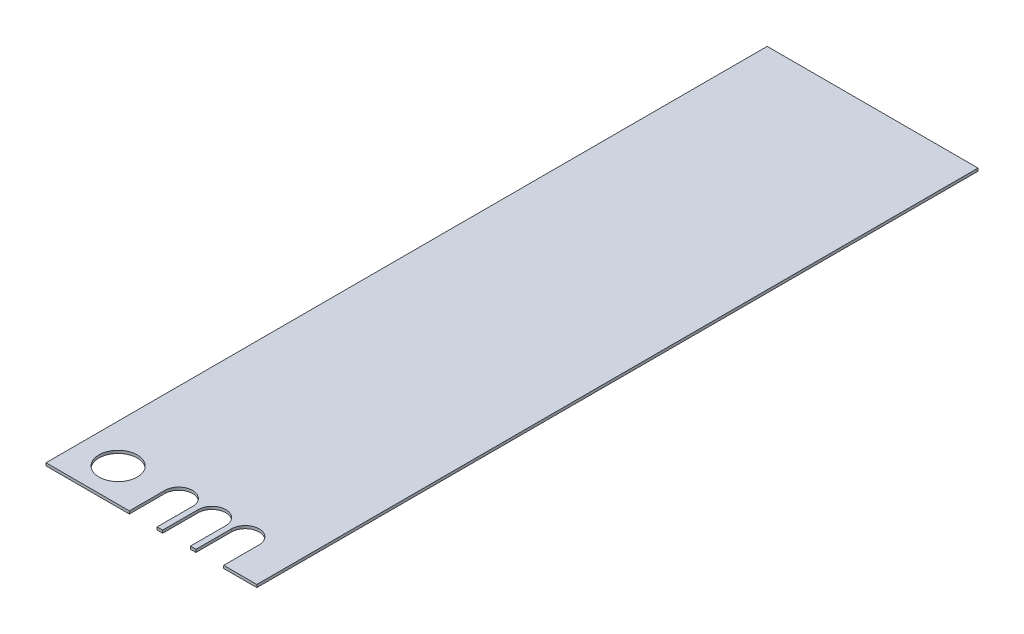
ISO-10303-21;
HEADER;
FILE_DESCRIPTION(('STEP AP214'),'2;1');
FILE_NAME('part.step','',(''),(''),'','','');
FILE_SCHEMA(('AUTOMOTIVE_DESIGN { 1 0 10303 214 1 1 1 1 }'));
ENDSEC;
DATA;
#1=APPLICATION_CONTEXT('core data for automotive mechanical design processes');
#2=APPLICATION_PROTOCOL_DEFINITION('international standard','automotive_design',2000,#1);
#3=PRODUCT_CONTEXT('',#1,'mechanical');
#4=PRODUCT('Part','Part','',(#3));
#5=PRODUCT_RELATED_PRODUCT_CATEGORY('part','',(#4));
#6=PRODUCT_DEFINITION_FORMATION('','',#4);
#7=PRODUCT_DEFINITION_CONTEXT('part definition',#1,'design');
#8=PRODUCT_DEFINITION('design','',#6,#7);
#9=PRODUCT_DEFINITION_SHAPE('','',#8);
#10=(LENGTH_UNIT() NAMED_UNIT(*) SI_UNIT(.MILLI.,.METRE.));
#11=(NAMED_UNIT(*) PLANE_ANGLE_UNIT() SI_UNIT($,.RADIAN.));
#12=(NAMED_UNIT(*) SI_UNIT($,.STERADIAN.) SOLID_ANGLE_UNIT());
#13=UNCERTAINTY_MEASURE_WITH_UNIT(LENGTH_MEASURE(1.E-05),#10,'distance_accuracy_value','');
#14=(GEOMETRIC_REPRESENTATION_CONTEXT(3) GLOBAL_UNCERTAINTY_ASSIGNED_CONTEXT((#13)) GLOBAL_UNIT_ASSIGNED_CONTEXT((#10,
#11,#12)) REPRESENTATION_CONTEXT('',''));
#15=CARTESIAN_POINT('',(0.,0.,0.));
#16=DIRECTION('',(0.,0.,1.));
#17=DIRECTION('',(1.,0.,0.));
#18=AXIS2_PLACEMENT_3D('',#15,#16,#17);
#19=CARTESIAN_POINT('',(-241.3,6.34999999999999,825.5));
#20=DIRECTION('',(0.,0.,-1.));
#21=DIRECTION('',(-1.,0.,0.));
#22=AXIS2_PLACEMENT_3D('',#19,#20,#21);
#23=PLANE('',#22);
#24=DIRECTION('',(1.,0.,0.));
#25=VECTOR('',#24,1.);
#26=CARTESIAN_POINT('',(-241.3,0.,825.5));
#27=LINE('',#26,#25);
#28=CARTESIAN_POINT('',(89.2554804423506,0.,825.5));
#29=VERTEX_POINT('',#28);
#30=CARTESIAN_POINT('',(101.955480442351,0.,825.5));
#31=VERTEX_POINT('',#30);
#32=EDGE_CURVE('E290',#29,#31,#27,.T.);
#33=ORIENTED_EDGE('',*,*,#32,.T.);
#34=DIRECTION('',(0.,-1.,0.));
#35=VECTOR('',#34,1.);
#36=CARTESIAN_POINT('',(101.955480442351,6.34999999999999,825.5));
#37=LINE('',#36,#35);
#38=CARTESIAN_POINT('',(101.955480442351,6.34999999999999,825.5));
#39=VERTEX_POINT('',#38);
#40=EDGE_CURVE('E198',#39,#31,#37,.T.);
#41=ORIENTED_EDGE('',*,*,#40,.F.);
#42=DIRECTION('',(1.,0.,0.));
#43=VECTOR('',#42,1.);
#44=CARTESIAN_POINT('',(-241.3,6.34999999999999,825.5));
#45=LINE('',#44,#43);
#46=CARTESIAN_POINT('',(89.2554804423506,6.34999999999999,825.5));
#47=VERTEX_POINT('',#46);
#48=EDGE_CURVE('E306',#47,#39,#45,.T.);
#49=ORIENTED_EDGE('',*,*,#48,.F.);
#50=DIRECTION('',(0.,-1.,0.));
#51=VECTOR('',#50,1.);
#52=CARTESIAN_POINT('',(89.2554804423506,6.34999999999999,825.5));
#53=LINE('',#52,#51);
#54=EDGE_CURVE('E225',#47,#29,#53,.T.);
#55=ORIENTED_EDGE('',*,*,#54,.T.);
#56=EDGE_LOOP('',(#33,#41,#49,#55));
#57=FACE_BOUND('',#56,.T.);
#58=ADVANCED_FACE('F32',(#57),#23,.F.);
#59=CARTESIAN_POINT('',(-241.3,0.,825.5));
#60=VERTEX_POINT('',#59);
#61=CARTESIAN_POINT('',(-50.4445195576494,0.,825.5));
#62=VERTEX_POINT('',#61);
#63=EDGE_CURVE('E240',#60,#62,#27,.T.);
#64=ORIENTED_EDGE('',*,*,#63,.T.);
#65=DIRECTION('',(0.,-1.,0.));
#66=VECTOR('',#65,1.);
#67=CARTESIAN_POINT('',(-50.4445195576494,6.34999999999999,825.5));
#68=LINE('',#67,#66);
#69=CARTESIAN_POINT('',(-50.4445195576494,6.34999999999999,825.5));
#70=VERTEX_POINT('',#69);
#71=EDGE_CURVE('E178',#70,#62,#68,.T.);
#72=ORIENTED_EDGE('',*,*,#71,.F.);
#73=CARTESIAN_POINT('',(-241.3,6.34999999999999,825.5));
#74=VERTEX_POINT('',#73);
#75=EDGE_CURVE('E245',#74,#70,#45,.T.);
#76=ORIENTED_EDGE('',*,*,#75,.F.);
#77=DIRECTION('',(0.,-1.,0.));
#78=VECTOR('',#77,1.);
#79=CARTESIAN_POINT('',(-241.3,6.34999999999999,825.5));
#80=LINE('',#79,#78);
#81=EDGE_CURVE('E261',#74,#60,#80,.T.);
#82=ORIENTED_EDGE('',*,*,#81,.T.);
#83=EDGE_LOOP('',(#64,#72,#76,#82));
#84=FACE_BOUND('',#83,.T.);
#85=ADVANCED_FACE('F280',(#84),#23,.F.);
#86=CARTESIAN_POINT('',(13.0554804423505,6.34999999999999,825.5));
#87=VERTEX_POINT('',#86);
#88=CARTESIAN_POINT('',(25.7554804423506,6.34999999999999,825.5));
#89=VERTEX_POINT('',#88);
#90=EDGE_CURVE('E248',#87,#89,#45,.T.);
#91=ORIENTED_EDGE('',*,*,#90,.F.);
#92=DIRECTION('',(0.,-1.,0.));
#93=VECTOR('',#92,1.);
#94=CARTESIAN_POINT('',(13.0554804423505,6.34999999999999,825.5));
#95=LINE('',#94,#93);
#96=CARTESIAN_POINT('',(13.0554804423505,0.,825.5));
#97=VERTEX_POINT('',#96);
#98=EDGE_CURVE('E151',#87,#97,#95,.T.);
#99=ORIENTED_EDGE('',*,*,#98,.T.);
#100=CARTESIAN_POINT('',(25.7554804423506,0.,825.5));
#101=VERTEX_POINT('',#100);
#102=EDGE_CURVE('E258',#97,#101,#27,.T.);
#103=ORIENTED_EDGE('',*,*,#102,.T.);
#104=DIRECTION('',(0.,-1.,0.));
#105=VECTOR('',#104,1.);
#106=CARTESIAN_POINT('',(25.7554804423506,6.34999999999999,825.5));
#107=LINE('',#106,#105);
#108=EDGE_CURVE('E223',#89,#101,#107,.T.);
#109=ORIENTED_EDGE('',*,*,#108,.F.);
#110=EDGE_LOOP('',(#91,#99,#103,#109));
#111=FACE_BOUND('',#110,.T.);
#112=ADVANCED_FACE('F299',(#111),#23,.F.);
#113=CARTESIAN_POINT('',(241.3,6.34999999999999,825.5));
#114=DIRECTION('',(-1.,0.,0.));
#115=DIRECTION('',(0.,0.,1.));
#116=AXIS2_PLACEMENT_3D('',#113,#114,#115);
#117=PLANE('',#116);
#118=DIRECTION('',(0.,0.,-1.));
#119=VECTOR('',#118,1.);
#120=CARTESIAN_POINT('',(241.3,0.,825.5));
#121=LINE('',#120,#119);
#122=CARTESIAN_POINT('',(241.3,0.,825.5));
#123=VERTEX_POINT('',#122);
#124=CARTESIAN_POINT('',(241.3,0.,-825.5));
#125=VERTEX_POINT('',#124);
#126=EDGE_CURVE('E233',#123,#125,#121,.T.);
#127=ORIENTED_EDGE('',*,*,#126,.T.);
#128=DIRECTION('',(0.,-1.,0.));
#129=VECTOR('',#128,1.);
#130=CARTESIAN_POINT('',(241.3,6.34999999999999,-825.5));
#131=LINE('',#130,#129);
#132=CARTESIAN_POINT('',(241.3,6.34999999999999,-825.5));
#133=VERTEX_POINT('',#132);
#134=EDGE_CURVE('E11',#133,#125,#131,.T.);
#135=ORIENTED_EDGE('',*,*,#134,.F.);
#136=DIRECTION('',(0.,0.,-1.));
#137=VECTOR('',#136,1.);
#138=CARTESIAN_POINT('',(241.3,6.34999999999999,825.5));
#139=LINE('',#138,#137);
#140=CARTESIAN_POINT('',(241.3,6.34999999999999,825.5));
#141=VERTEX_POINT('',#140);
#142=EDGE_CURVE('E236',#141,#133,#139,.T.);
#143=ORIENTED_EDGE('',*,*,#142,.F.);
#144=DIRECTION('',(0.,-1.,0.));
#145=VECTOR('',#144,1.);
#146=CARTESIAN_POINT('',(241.3,6.34999999999999,825.5));
#147=LINE('',#146,#145);
#148=EDGE_CURVE('E247',#141,#123,#147,.T.);
#149=ORIENTED_EDGE('',*,*,#148,.T.);
#150=EDGE_LOOP('',(#127,#135,#143,#149));
#151=FACE_BOUND('',#150,.T.);
#152=ADVANCED_FACE('F34',(#151),#117,.F.);
#153=CARTESIAN_POINT('',(-241.3,6.34999999999999,-825.5));
#154=DIRECTION('',(0.,0.,1.));
#155=DIRECTION('',(1.,0.,0.));
#156=AXIS2_PLACEMENT_3D('',#153,#154,#155);
#157=PLANE('',#156);
#158=DIRECTION('',(-1.,0.,0.));
#159=VECTOR('',#158,1.);
#160=CARTESIAN_POINT('',(-241.3,0.,-825.5));
#161=LINE('',#160,#159);
#162=CARTESIAN_POINT('',(-241.3,0.,-825.5));
#163=VERTEX_POINT('',#162);
#164=EDGE_CURVE('E251',#125,#163,#161,.T.);
#165=ORIENTED_EDGE('',*,*,#164,.T.);
#166=DIRECTION('',(0.,-1.,0.));
#167=VECTOR('',#166,1.);
#168=CARTESIAN_POINT('',(-241.3,6.34999999999999,-825.5));
#169=LINE('',#168,#167);
#170=CARTESIAN_POINT('',(-241.3,6.34999999999999,-825.5));
#171=VERTEX_POINT('',#170);
#172=EDGE_CURVE('E40',#171,#163,#169,.T.);
#173=ORIENTED_EDGE('',*,*,#172,.F.);
#174=DIRECTION('',(-1.,0.,0.));
#175=VECTOR('',#174,1.);
#176=CARTESIAN_POINT('',(-241.3,6.34999999999999,-825.5));
#177=LINE('',#176,#175);
#178=EDGE_CURVE('E239',#133,#171,#177,.T.);
#179=ORIENTED_EDGE('',*,*,#178,.F.);
#180=ORIENTED_EDGE('',*,*,#134,.T.);
#181=EDGE_LOOP('',(#165,#173,#179,#180));
#182=FACE_BOUND('',#181,.T.);
#183=ADVANCED_FACE('F284',(#182),#157,.F.);
#184=CARTESIAN_POINT('',(-241.3,6.34999999999999,825.5));
#185=DIRECTION('',(1.,0.,0.));
#186=DIRECTION('',(0.,0.,-1.));
#187=AXIS2_PLACEMENT_3D('',#184,#185,#186);
#188=PLANE('',#187);
#189=DIRECTION('',(0.,0.,1.));
#190=VECTOR('',#189,1.);
#191=CARTESIAN_POINT('',(-241.3,0.,825.5));
#192=LINE('',#191,#190);
#193=EDGE_CURVE('E253',#163,#60,#192,.T.);
#194=ORIENTED_EDGE('',*,*,#193,.T.);
#195=ORIENTED_EDGE('',*,*,#81,.F.);
#196=DIRECTION('',(0.,0.,1.));
#197=VECTOR('',#196,1.);
#198=CARTESIAN_POINT('',(-241.3,6.34999999999999,825.5));
#199=LINE('',#198,#197);
#200=EDGE_CURVE('E242',#171,#74,#199,.T.);
#201=ORIENTED_EDGE('',*,*,#200,.F.);
#202=ORIENTED_EDGE('',*,*,#172,.T.);
#203=EDGE_LOOP('',(#194,#195,#201,#202));
#204=FACE_BOUND('',#203,.T.);
#205=ADVANCED_FACE('F268',(#204),#188,.F.);
#206=CARTESIAN_POINT('',(165.455480442351,6.34999999999999,825.5));
#207=VERTEX_POINT('',#206);
#208=EDGE_CURVE('E244',#207,#141,#45,.T.);
#209=ORIENTED_EDGE('',*,*,#208,.F.);
#210=DIRECTION('',(0.,-1.,0.));
#211=VECTOR('',#210,1.);
#212=CARTESIAN_POINT('',(165.455480442351,6.34999999999999,825.5));
#213=LINE('',#212,#211);
#214=CARTESIAN_POINT('',(165.455480442351,0.,825.5));
#215=VERTEX_POINT('',#214);
#216=EDGE_CURVE('E200',#207,#215,#213,.T.);
#217=ORIENTED_EDGE('',*,*,#216,.T.);
#218=EDGE_CURVE('E255',#215,#123,#27,.T.);
#219=ORIENTED_EDGE('',*,*,#218,.T.);
#220=ORIENTED_EDGE('',*,*,#148,.F.);
#221=EDGE_LOOP('',(#209,#217,#219,#220));
#222=FACE_BOUND('',#221,.T.);
#223=ADVANCED_FACE('F310',(#222),#23,.F.);
#224=CARTESIAN_POINT('',(0.,6.34999999999999,0.));
#225=DIRECTION('',(0.,-1.,0.));
#226=DIRECTION('',(0.,0.,-1.));
#227=AXIS2_PLACEMENT_3D('',#224,#225,#226);
#228=PLANE('',#227);
#229=CARTESIAN_POINT('',(-152.4,6.34999999999999,749.3));
#230=DIRECTION('',(0.,1.,0.));
#231=DIRECTION('',(0.,0.,1.));
#232=AXIS2_PLACEMENT_3D('',#229,#230,#231);
#233=CIRCLE('',#232,43.9236493635122);
#234=CARTESIAN_POINT('',(-152.4,6.34999999999999,793.223649363512));
#235=VERTEX_POINT('',#234);
#236=EDGE_CURVE('E222',#235,#235,#233,.T.);
#237=ORIENTED_EDGE('',*,*,#236,.F.);
#238=EDGE_LOOP('',(#237));
#239=FACE_BOUND('',#238,.T.);
#240=ORIENTED_EDGE('',*,*,#48,.T.);
#241=DIRECTION('',(0.,0.,-1.));
#242=VECTOR('',#241,1.);
#243=CARTESIAN_POINT('',(101.955480442351,6.34999999999999,744.293611592998));
#244=LINE('',#243,#242);
#245=CARTESIAN_POINT('',(101.955480442351,6.34999999999999,744.293611592998));
#246=VERTEX_POINT('',#245);
#247=EDGE_CURVE('E188',#39,#246,#244,.T.);
#248=ORIENTED_EDGE('',*,*,#247,.T.);
#249=CARTESIAN_POINT('',(133.705480442351,6.34999999999999,744.293611592998));
#250=DIRECTION('',(0.,-1.,0.));
#251=DIRECTION('',(0.,0.,-1.));
#252=AXIS2_PLACEMENT_3D('',#249,#250,#251);
#253=CIRCLE('',#252,31.75);
#254=CARTESIAN_POINT('',(165.455480442351,6.34999999999999,744.293611592998));
#255=VERTEX_POINT('',#254);
#256=EDGE_CURVE('E181',#246,#255,#253,.T.);
#257=ORIENTED_EDGE('',*,*,#256,.T.);
#258=DIRECTION('',(0.,0.,1.));
#259=VECTOR('',#258,1.);
#260=CARTESIAN_POINT('',(165.455480442351,6.34999999999999,825.5));
#261=LINE('',#260,#259);
#262=EDGE_CURVE('E184',#255,#207,#261,.T.);
#263=ORIENTED_EDGE('',*,*,#262,.T.);
#264=ORIENTED_EDGE('',*,*,#208,.T.);
#265=ORIENTED_EDGE('',*,*,#142,.T.);
#266=ORIENTED_EDGE('',*,*,#178,.T.);
#267=ORIENTED_EDGE('',*,*,#200,.T.);
#268=ORIENTED_EDGE('',*,*,#75,.T.);
#269=DIRECTION('',(0.,0.,-1.));
#270=VECTOR('',#269,1.);
#271=CARTESIAN_POINT('',(-50.4445195576494,6.34999999999999,744.293611592998));
#272=LINE('',#271,#270);
#273=CARTESIAN_POINT('',(-50.4445195576494,6.34999999999999,744.293611592998));
#274=VERTEX_POINT('',#273);
#275=EDGE_CURVE('E152',#70,#274,#272,.T.);
#276=ORIENTED_EDGE('',*,*,#275,.T.);
#277=CARTESIAN_POINT('',(-18.6945195576494,6.34999999999999,744.293611592998));
#278=DIRECTION('',(0.,-1.,0.));
#279=DIRECTION('',(0.,0.,-1.));
#280=AXIS2_PLACEMENT_3D('',#277,#278,#279);
#281=CIRCLE('',#280,31.75);
#282=CARTESIAN_POINT('',(13.0554804423505,6.34999999999999,744.293611592998));
#283=VERTEX_POINT('',#282);
#284=EDGE_CURVE('E147',#274,#283,#281,.T.);
#285=ORIENTED_EDGE('',*,*,#284,.T.);
#286=DIRECTION('',(0.,0.,1.));
#287=VECTOR('',#286,1.);
#288=CARTESIAN_POINT('',(13.0554804423505,6.34999999999999,825.5));
#289=LINE('',#288,#287);
#290=EDGE_CURVE('E155',#283,#87,#289,.T.);
#291=ORIENTED_EDGE('',*,*,#290,.T.);
#292=ORIENTED_EDGE('',*,*,#90,.T.);
#293=DIRECTION('',(0.,0.,-1.));
#294=VECTOR('',#293,1.);
#295=CARTESIAN_POINT('',(25.7554804423506,6.34999999999999,744.293611592998));
#296=LINE('',#295,#294);
#297=CARTESIAN_POINT('',(25.7554804423506,6.34999999999999,744.293611592998));
#298=VERTEX_POINT('',#297);
#299=EDGE_CURVE('E211',#89,#298,#296,.T.);
#300=ORIENTED_EDGE('',*,*,#299,.T.);
#301=CARTESIAN_POINT('',(57.5054804423506,6.34999999999999,744.293611592998));
#302=DIRECTION('',(0.,-1.,0.));
#303=DIRECTION('',(0.,0.,-1.));
#304=AXIS2_PLACEMENT_3D('',#301,#302,#303);
#305=CIRCLE('',#304,31.75);
#306=CARTESIAN_POINT('',(89.2554804423506,6.34999999999999,744.293611592998));
#307=VERTEX_POINT('',#306);
#308=EDGE_CURVE('E204',#298,#307,#305,.T.);
#309=ORIENTED_EDGE('',*,*,#308,.T.);
#310=DIRECTION('',(0.,0.,1.));
#311=VECTOR('',#310,1.);
#312=CARTESIAN_POINT('',(89.2554804423506,6.34999999999999,825.5));
#313=LINE('',#312,#311);
#314=EDGE_CURVE('E207',#307,#47,#313,.T.);
#315=ORIENTED_EDGE('',*,*,#314,.T.);
#316=EDGE_LOOP('',(#240,#248,#257,#263,#264,#265,#266,#267,#268,#276,#285,#291,#292,#300,#309,#315));
#317=FACE_BOUND('',#316,.T.);
#318=ADVANCED_FACE('F163',(#239,#317),#228,.F.);
#319=CARTESIAN_POINT('',(0.,0.,0.));
#320=DIRECTION('',(0.,-1.,0.));
#321=DIRECTION('',(0.,0.,-1.));
#322=AXIS2_PLACEMENT_3D('',#319,#320,#321);
#323=PLANE('',#322);
#324=DIRECTION('',(0.,0.,-1.));
#325=VECTOR('',#324,1.);
#326=CARTESIAN_POINT('',(101.955480442351,0.,744.293611592998));
#327=LINE('',#326,#325);
#328=CARTESIAN_POINT('',(101.955480442351,0.,744.293611592998));
#329=VERTEX_POINT('',#328);
#330=EDGE_CURVE('E185',#31,#329,#327,.T.);
#331=ORIENTED_EDGE('',*,*,#330,.F.);
#332=ORIENTED_EDGE('',*,*,#32,.F.);
#333=DIRECTION('',(0.,0.,1.));
#334=VECTOR('',#333,1.);
#335=CARTESIAN_POINT('',(89.2554804423506,0.,825.5));
#336=LINE('',#335,#334);
#337=CARTESIAN_POINT('',(89.2554804423506,0.,744.293611592998));
#338=VERTEX_POINT('',#337);
#339=EDGE_CURVE('E216',#338,#29,#336,.T.);
#340=ORIENTED_EDGE('',*,*,#339,.F.);
#341=CARTESIAN_POINT('',(57.5054804423506,0.,744.293611592998));
#342=DIRECTION('',(0.,-1.,0.));
#343=DIRECTION('',(0.,0.,-1.));
#344=AXIS2_PLACEMENT_3D('',#341,#342,#343);
#345=CIRCLE('',#344,31.75);
#346=CARTESIAN_POINT('',(25.7554804423506,0.,744.293611592998));
#347=VERTEX_POINT('',#346);
#348=EDGE_CURVE('E177',#347,#338,#345,.T.);
#349=ORIENTED_EDGE('',*,*,#348,.F.);
#350=DIRECTION('',(0.,0.,-1.));
#351=VECTOR('',#350,1.);
#352=CARTESIAN_POINT('',(25.7554804423506,0.,744.293611592998));
#353=LINE('',#352,#351);
#354=EDGE_CURVE('E208',#101,#347,#353,.T.);
#355=ORIENTED_EDGE('',*,*,#354,.F.);
#356=ORIENTED_EDGE('',*,*,#102,.F.);
#357=DIRECTION('',(0.,0.,1.));
#358=VECTOR('',#357,1.);
#359=CARTESIAN_POINT('',(13.0554804423505,0.,825.5));
#360=LINE('',#359,#358);
#361=CARTESIAN_POINT('',(13.0554804423505,0.,744.293611592998));
#362=VERTEX_POINT('',#361);
#363=EDGE_CURVE('E168',#362,#97,#360,.T.);
#364=ORIENTED_EDGE('',*,*,#363,.F.);
#365=CARTESIAN_POINT('',(-18.6945195576494,0.,744.293611592998));
#366=DIRECTION('',(0.,-1.,0.));
#367=DIRECTION('',(0.,0.,-1.));
#368=AXIS2_PLACEMENT_3D('',#365,#366,#367);
#369=CIRCLE('',#368,31.75);
#370=CARTESIAN_POINT('',(-50.4445195576494,0.,744.293611592998));
#371=VERTEX_POINT('',#370);
#372=EDGE_CURVE('E55',#371,#362,#369,.T.);
#373=ORIENTED_EDGE('',*,*,#372,.F.);
#374=DIRECTION('',(0.,0.,-1.));
#375=VECTOR('',#374,1.);
#376=CARTESIAN_POINT('',(-50.4445195576494,0.,744.293611592998));
#377=LINE('',#376,#375);
#378=EDGE_CURVE('E165',#62,#371,#377,.T.);
#379=ORIENTED_EDGE('',*,*,#378,.F.);
#380=ORIENTED_EDGE('',*,*,#63,.F.);
#381=ORIENTED_EDGE('',*,*,#193,.F.);
#382=ORIENTED_EDGE('',*,*,#164,.F.);
#383=ORIENTED_EDGE('',*,*,#126,.F.);
#384=ORIENTED_EDGE('',*,*,#218,.F.);
#385=DIRECTION('',(0.,0.,1.));
#386=VECTOR('',#385,1.);
#387=CARTESIAN_POINT('',(165.455480442351,0.,825.5));
#388=LINE('',#387,#386);
#389=CARTESIAN_POINT('',(165.455480442351,0.,744.293611592998));
#390=VERTEX_POINT('',#389);
#391=EDGE_CURVE('E193',#390,#215,#388,.T.);
#392=ORIENTED_EDGE('',*,*,#391,.F.);
#393=CARTESIAN_POINT('',(133.705480442351,0.,744.293611592998));
#394=DIRECTION('',(0.,-1.,0.));
#395=DIRECTION('',(0.,0.,-1.));
#396=AXIS2_PLACEMENT_3D('',#393,#394,#395);
#397=CIRCLE('',#396,31.75);
#398=EDGE_CURVE('E47',#329,#390,#397,.T.);
#399=ORIENTED_EDGE('',*,*,#398,.F.);
#400=EDGE_LOOP('',(#331,#332,#340,#349,#355,#356,#364,#373,#379,#380,#381,#382,#383,#384,#392,#399));
#401=FACE_BOUND('',#400,.T.);
#402=CARTESIAN_POINT('',(-152.4,0.,749.3));
#403=DIRECTION('',(0.,1.,0.));
#404=DIRECTION('',(0.,0.,1.));
#405=AXIS2_PLACEMENT_3D('',#402,#403,#404);
#406=CIRCLE('',#405,43.9236493635122);
#407=CARTESIAN_POINT('',(-152.4,0.,793.223649363512));
#408=VERTEX_POINT('',#407);
#409=EDGE_CURVE('E230',#408,#408,#406,.T.);
#410=ORIENTED_EDGE('',*,*,#409,.T.);
#411=EDGE_LOOP('',(#410));
#412=FACE_BOUND('',#411,.T.);
#413=ADVANCED_FACE('F274',(#401,#412),#323,.T.);
#414=CARTESIAN_POINT('',(-152.4,0.,749.3));
#415=DIRECTION('',(0.,1.,0.));
#416=DIRECTION('',(0.,0.,1.));
#417=AXIS2_PLACEMENT_3D('',#414,#415,#416);
#418=CYLINDRICAL_SURFACE('',#417,43.9236493635122);
#419=ORIENTED_EDGE('',*,*,#409,.F.);
#420=EDGE_LOOP('',(#419));
#421=FACE_BOUND('',#420,.T.);
#422=ORIENTED_EDGE('',*,*,#236,.T.);
#423=EDGE_LOOP('',(#422));
#424=FACE_BOUND('',#423,.T.);
#425=ADVANCED_FACE('F347',(#421,#424),#418,.F.);
#426=CARTESIAN_POINT('',(57.5054804423506,6.34999999999999,744.293611592998));
#427=DIRECTION('',(0.,-1.,0.));
#428=DIRECTION('',(0.,0.,-1.));
#429=AXIS2_PLACEMENT_3D('',#426,#427,#428);
#430=CYLINDRICAL_SURFACE('',#429,31.75);
#431=ORIENTED_EDGE('',*,*,#348,.T.);
#432=DIRECTION('',(0.,-1.,0.));
#433=VECTOR('',#432,1.);
#434=CARTESIAN_POINT('',(89.2554804423506,6.34999999999999,744.293611592998));
#435=LINE('',#434,#433);
#436=EDGE_CURVE('E214',#307,#338,#435,.T.);
#437=ORIENTED_EDGE('',*,*,#436,.F.);
#438=ORIENTED_EDGE('',*,*,#308,.F.);
#439=DIRECTION('',(0.,-1.,0.));
#440=VECTOR('',#439,1.);
#441=CARTESIAN_POINT('',(25.7554804423506,6.34999999999999,744.293611592998));
#442=LINE('',#441,#440);
#443=EDGE_CURVE('E220',#298,#347,#442,.T.);
#444=ORIENTED_EDGE('',*,*,#443,.T.);
#445=EDGE_LOOP('',(#431,#437,#438,#444));
#446=FACE_BOUND('',#445,.T.);
#447=ADVANCED_FACE('F341',(#446),#430,.F.);
#448=CARTESIAN_POINT('',(25.7554804423506,6.34999999999999,744.293611592998));
#449=DIRECTION('',(-1.,0.,0.));
#450=DIRECTION('',(0.,0.,1.));
#451=AXIS2_PLACEMENT_3D('',#448,#449,#450);
#452=PLANE('',#451);
#453=ORIENTED_EDGE('',*,*,#354,.T.);
#454=ORIENTED_EDGE('',*,*,#443,.F.);
#455=ORIENTED_EDGE('',*,*,#299,.F.);
#456=ORIENTED_EDGE('',*,*,#108,.T.);
#457=EDGE_LOOP('',(#453,#454,#455,#456));
#458=FACE_BOUND('',#457,.T.);
#459=ADVANCED_FACE('F304',(#458),#452,.F.);
#460=CARTESIAN_POINT('',(89.2554804423506,6.34999999999999,825.5));
#461=DIRECTION('',(1.,0.,0.));
#462=DIRECTION('',(0.,0.,-1.));
#463=AXIS2_PLACEMENT_3D('',#460,#461,#462);
#464=PLANE('',#463);
#465=ORIENTED_EDGE('',*,*,#339,.T.);
#466=ORIENTED_EDGE('',*,*,#54,.F.);
#467=ORIENTED_EDGE('',*,*,#314,.F.);
#468=ORIENTED_EDGE('',*,*,#436,.T.);
#469=EDGE_LOOP('',(#465,#466,#467,#468));
#470=FACE_BOUND('',#469,.T.);
#471=ADVANCED_FACE('F357',(#470),#464,.F.);
#472=CARTESIAN_POINT('',(-18.6945195576494,6.34999999999999,744.293611592998));
#473=DIRECTION('',(0.,-1.,0.));
#474=DIRECTION('',(0.,0.,-1.));
#475=AXIS2_PLACEMENT_3D('',#472,#473,#474);
#476=CYLINDRICAL_SURFACE('',#475,31.75);
#477=ORIENTED_EDGE('',*,*,#372,.T.);
#478=DIRECTION('',(0.,-1.,0.));
#479=VECTOR('',#478,1.);
#480=CARTESIAN_POINT('',(13.0554804423505,6.34999999999999,744.293611592998));
#481=LINE('',#480,#479);
#482=EDGE_CURVE('E143',#283,#362,#481,.T.);
#483=ORIENTED_EDGE('',*,*,#482,.F.);
#484=ORIENTED_EDGE('',*,*,#284,.F.);
#485=DIRECTION('',(0.,-1.,0.));
#486=VECTOR('',#485,1.);
#487=CARTESIAN_POINT('',(-50.4445195576494,6.34999999999999,744.293611592998));
#488=LINE('',#487,#486);
#489=EDGE_CURVE('E175',#274,#371,#488,.T.);
#490=ORIENTED_EDGE('',*,*,#489,.T.);
#491=EDGE_LOOP('',(#477,#483,#484,#490));
#492=FACE_BOUND('',#491,.T.);
#493=ADVANCED_FACE('F145',(#492),#476,.F.);
#494=CARTESIAN_POINT('',(-50.4445195576494,6.34999999999999,744.293611592998));
#495=DIRECTION('',(-1.,0.,0.));
#496=DIRECTION('',(0.,0.,1.));
#497=AXIS2_PLACEMENT_3D('',#494,#495,#496);
#498=PLANE('',#497);
#499=ORIENTED_EDGE('',*,*,#378,.T.);
#500=ORIENTED_EDGE('',*,*,#489,.F.);
#501=ORIENTED_EDGE('',*,*,#275,.F.);
#502=ORIENTED_EDGE('',*,*,#71,.T.);
#503=EDGE_LOOP('',(#499,#500,#501,#502));
#504=FACE_BOUND('',#503,.T.);
#505=ADVANCED_FACE('F373',(#504),#498,.F.);
#506=CARTESIAN_POINT('',(13.0554804423505,6.34999999999999,825.5));
#507=DIRECTION('',(1.,0.,0.));
#508=DIRECTION('',(0.,0.,-1.));
#509=AXIS2_PLACEMENT_3D('',#506,#507,#508);
#510=PLANE('',#509);
#511=ORIENTED_EDGE('',*,*,#363,.T.);
#512=ORIENTED_EDGE('',*,*,#98,.F.);
#513=ORIENTED_EDGE('',*,*,#290,.F.);
#514=ORIENTED_EDGE('',*,*,#482,.T.);
#515=EDGE_LOOP('',(#511,#512,#513,#514));
#516=FACE_BOUND('',#515,.T.);
#517=ADVANCED_FACE('F156',(#516),#510,.F.);
#518=CARTESIAN_POINT('',(133.705480442351,6.34999999999999,744.293611592998));
#519=DIRECTION('',(0.,-1.,0.));
#520=DIRECTION('',(0.,0.,-1.));
#521=AXIS2_PLACEMENT_3D('',#518,#519,#520);
#522=CYLINDRICAL_SURFACE('',#521,31.75);
#523=ORIENTED_EDGE('',*,*,#398,.T.);
#524=DIRECTION('',(0.,-1.,0.));
#525=VECTOR('',#524,1.);
#526=CARTESIAN_POINT('',(165.455480442351,6.34999999999999,744.293611592998));
#527=LINE('',#526,#525);
#528=EDGE_CURVE('E191',#255,#390,#527,.T.);
#529=ORIENTED_EDGE('',*,*,#528,.F.);
#530=ORIENTED_EDGE('',*,*,#256,.F.);
#531=DIRECTION('',(0.,-1.,0.));
#532=VECTOR('',#531,1.);
#533=CARTESIAN_POINT('',(101.955480442351,6.34999999999999,744.293611592998));
#534=LINE('',#533,#532);
#535=EDGE_CURVE('E173',#246,#329,#534,.T.);
#536=ORIENTED_EDGE('',*,*,#535,.T.);
#537=EDGE_LOOP('',(#523,#529,#530,#536));
#538=FACE_BOUND('',#537,.T.);
#539=ADVANCED_FACE('F389',(#538),#522,.F.);
#540=CARTESIAN_POINT('',(101.955480442351,6.34999999999999,744.293611592998));
#541=DIRECTION('',(-1.,0.,0.));
#542=DIRECTION('',(0.,0.,1.));
#543=AXIS2_PLACEMENT_3D('',#540,#541,#542);
#544=PLANE('',#543);
#545=ORIENTED_EDGE('',*,*,#330,.T.);
#546=ORIENTED_EDGE('',*,*,#535,.F.);
#547=ORIENTED_EDGE('',*,*,#247,.F.);
#548=ORIENTED_EDGE('',*,*,#40,.T.);
#549=EDGE_LOOP('',(#545,#546,#547,#548));
#550=FACE_BOUND('',#549,.T.);
#551=ADVANCED_FACE('F397',(#550),#544,.F.);
#552=CARTESIAN_POINT('',(165.455480442351,6.34999999999999,825.5));
#553=DIRECTION('',(1.,0.,0.));
#554=DIRECTION('',(0.,0.,-1.));
#555=AXIS2_PLACEMENT_3D('',#552,#553,#554);
#556=PLANE('',#555);
#557=ORIENTED_EDGE('',*,*,#391,.T.);
#558=ORIENTED_EDGE('',*,*,#216,.F.);
#559=ORIENTED_EDGE('',*,*,#262,.F.);
#560=ORIENTED_EDGE('',*,*,#528,.T.);
#561=EDGE_LOOP('',(#557,#558,#559,#560));
#562=FACE_BOUND('',#561,.T.);
#563=ADVANCED_FACE('F405',(#562),#556,.F.);
#564=CLOSED_SHELL('',(#58,#85,#112,#152,#183,#205,#223,#318,#413,#425,#447,#459,#471,#493,#505,
#517,#539,#551,#563));
#565=MANIFOLD_SOLID_BREP('B2',#564);
#566=ADVANCED_BREP_SHAPE_REPRESENTATION('',(#18,#565),#14);
#567=SHAPE_DEFINITION_REPRESENTATION(#9,#566);
ENDSEC;
END-ISO-10303-21;
